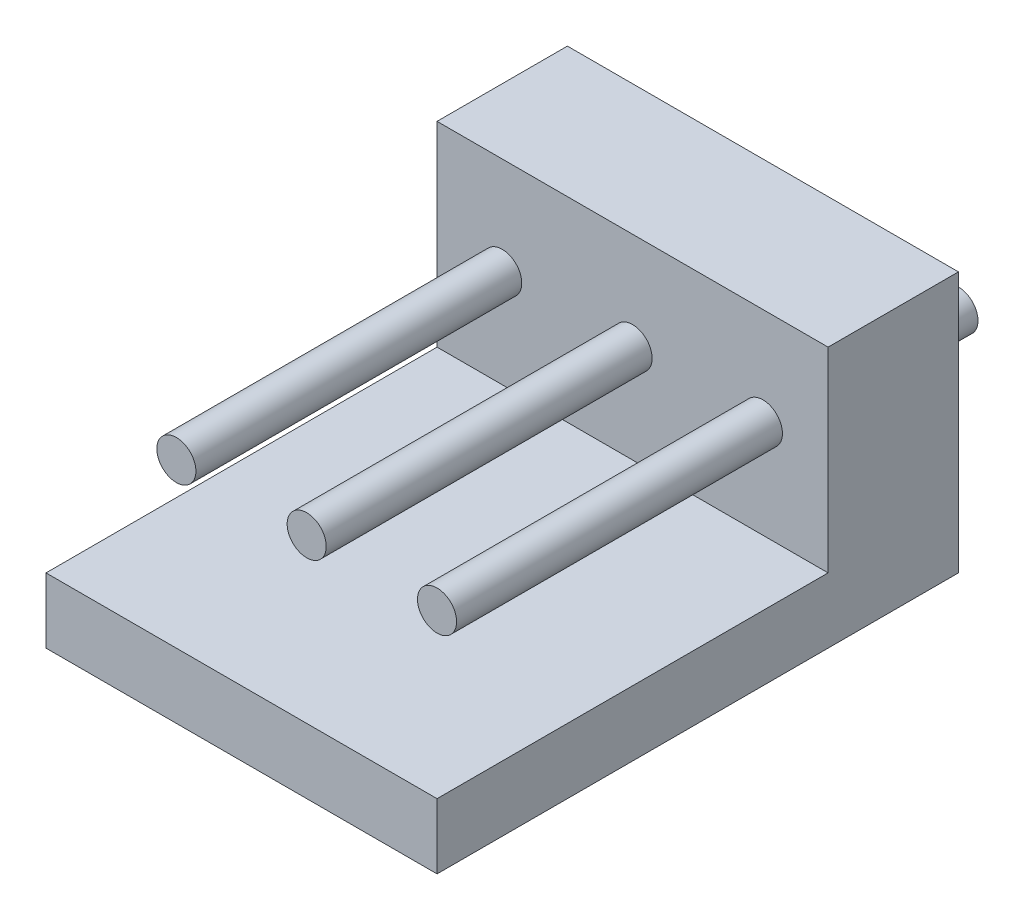
ISO-10303-21;
HEADER;
FILE_DESCRIPTION(('STEP AP214'),'2;1');
FILE_NAME('part.step','',(''),(''),'','','');
FILE_SCHEMA(('AUTOMOTIVE_DESIGN { 1 0 10303 214 1 1 1 1 }'));
ENDSEC;
DATA;
#1=APPLICATION_CONTEXT('core data for automotive mechanical design processes');
#2=APPLICATION_PROTOCOL_DEFINITION('international standard','automotive_design',2000,#1);
#3=PRODUCT_CONTEXT('',#1,'mechanical');
#4=PRODUCT('Part','Part','',(#3));
#5=PRODUCT_RELATED_PRODUCT_CATEGORY('part','',(#4));
#6=PRODUCT_DEFINITION_FORMATION('','',#4);
#7=PRODUCT_DEFINITION_CONTEXT('part definition',#1,'design');
#8=PRODUCT_DEFINITION('design','',#6,#7);
#9=PRODUCT_DEFINITION_SHAPE('','',#8);
#10=(LENGTH_UNIT() NAMED_UNIT(*) SI_UNIT(.MILLI.,.METRE.));
#11=(NAMED_UNIT(*) PLANE_ANGLE_UNIT() SI_UNIT($,.RADIAN.));
#12=(NAMED_UNIT(*) SI_UNIT($,.STERADIAN.) SOLID_ANGLE_UNIT());
#13=UNCERTAINTY_MEASURE_WITH_UNIT(LENGTH_MEASURE(1.E-05),#10,'distance_accuracy_value','');
#14=(GEOMETRIC_REPRESENTATION_CONTEXT(3) GLOBAL_UNCERTAINTY_ASSIGNED_CONTEXT((#13)) GLOBAL_UNIT_ASSIGNED_CONTEXT((#10,
#11,#12)) REPRESENTATION_CONTEXT('',''));
#15=CARTESIAN_POINT('',(0.,0.,0.));
#16=DIRECTION('',(0.,0.,1.));
#17=DIRECTION('',(1.,0.,0.));
#18=AXIS2_PLACEMENT_3D('',#15,#16,#17);
#19=CARTESIAN_POINT('',(0.,10.,5.));
#20=DIRECTION('',(0.,0.,-1.));
#21=DIRECTION('',(-1.,0.,0.));
#22=AXIS2_PLACEMENT_3D('',#19,#20,#21);
#23=PLANE('',#22);
#24=CARTESIAN_POINT('',(12.5,6.25,5.));
#25=DIRECTION('',(0.,0.,-1.));
#26=DIRECTION('',(-1.,0.,0.));
#27=AXIS2_PLACEMENT_3D('',#24,#25,#26);
#28=CIRCLE('',#27,0.750000000000002);
#29=CARTESIAN_POINT('',(11.75,6.25,5.));
#30=VERTEX_POINT('',#29);
#31=EDGE_CURVE('E37',#30,#30,#28,.F.);
#32=ORIENTED_EDGE('',*,*,#31,.F.);
#33=EDGE_LOOP('',(#32));
#34=FACE_BOUND('',#33,.T.);
#35=DIRECTION('',(-1.,0.,0.));
#36=VECTOR('',#35,1.);
#37=CARTESIAN_POINT('',(0.,2.5,5.));
#38=LINE('',#37,#36);
#39=CARTESIAN_POINT('',(15.,2.5,5.));
#40=VERTEX_POINT('',#39);
#41=CARTESIAN_POINT('',(0.,2.5,5.));
#42=VERTEX_POINT('',#41);
#43=EDGE_CURVE('E45',#40,#42,#38,.T.);
#44=ORIENTED_EDGE('',*,*,#43,.F.);
#45=DIRECTION('',(0.,1.,0.));
#46=VECTOR('',#45,1.);
#47=CARTESIAN_POINT('',(15.,0.,5.));
#48=LINE('',#47,#46);
#49=CARTESIAN_POINT('',(15.,10.,5.));
#50=VERTEX_POINT('',#49);
#51=EDGE_CURVE('E85',#40,#50,#48,.T.);
#52=ORIENTED_EDGE('',*,*,#51,.T.);
#53=DIRECTION('',(-1.,0.,0.));
#54=VECTOR('',#53,1.);
#55=CARTESIAN_POINT('',(0.,10.,5.));
#56=LINE('',#55,#54);
#57=CARTESIAN_POINT('',(0.,10.,5.));
#58=VERTEX_POINT('',#57);
#59=EDGE_CURVE('E50',#50,#58,#56,.T.);
#60=ORIENTED_EDGE('',*,*,#59,.T.);
#61=DIRECTION('',(0.,-1.,0.));
#62=VECTOR('',#61,1.);
#63=CARTESIAN_POINT('',(0.,0.,5.));
#64=LINE('',#63,#62);
#65=EDGE_CURVE('E80',#58,#42,#64,.T.);
#66=ORIENTED_EDGE('',*,*,#65,.T.);
#67=EDGE_LOOP('',(#44,#52,#60,#66));
#68=FACE_BOUND('',#67,.T.);
#69=CARTESIAN_POINT('',(7.50000000000001,6.25,5.));
#70=DIRECTION('',(0.,0.,-1.));
#71=DIRECTION('',(-1.,0.,0.));
#72=AXIS2_PLACEMENT_3D('',#69,#70,#71);
#73=CIRCLE('',#72,0.749999999999998);
#74=CARTESIAN_POINT('',(6.75000000000001,6.25,5.));
#75=VERTEX_POINT('',#74);
#76=EDGE_CURVE('E134',#75,#75,#73,.F.);
#77=ORIENTED_EDGE('',*,*,#76,.F.);
#78=EDGE_LOOP('',(#77));
#79=FACE_BOUND('',#78,.T.);
#80=CARTESIAN_POINT('',(2.5,6.25,5.));
#81=DIRECTION('',(0.,0.,-1.));
#82=DIRECTION('',(-1.,0.,0.));
#83=AXIS2_PLACEMENT_3D('',#80,#81,#82);
#84=CIRCLE('',#83,0.75);
#85=CARTESIAN_POINT('',(1.75,6.25,5.));
#86=VERTEX_POINT('',#85);
#87=EDGE_CURVE('E11',#86,#86,#84,.F.);
#88=ORIENTED_EDGE('',*,*,#87,.F.);
#89=EDGE_LOOP('',(#88));
#90=FACE_BOUND('',#89,.T.);
#91=ADVANCED_FACE('F28',(#34,#68,#79,#90),#23,.F.);
#92=CARTESIAN_POINT('',(0.,10.,0.));
#93=DIRECTION('',(0.,0.,-1.));
#94=DIRECTION('',(-1.,0.,0.));
#95=AXIS2_PLACEMENT_3D('',#92,#93,#94);
#96=PLANE('',#95);
#97=CARTESIAN_POINT('',(12.5,6.25,0.));
#98=DIRECTION('',(0.,0.,-1.));
#99=DIRECTION('',(-1.,0.,0.));
#100=AXIS2_PLACEMENT_3D('',#97,#98,#99);
#101=CIRCLE('',#100,0.750000000000002);
#102=CARTESIAN_POINT('',(11.75,6.25,0.));
#103=VERTEX_POINT('',#102);
#104=EDGE_CURVE('E117',#103,#103,#101,.F.);
#105=ORIENTED_EDGE('',*,*,#104,.T.);
#106=EDGE_LOOP('',(#105));
#107=FACE_BOUND('',#106,.T.);
#108=DIRECTION('',(0.,-1.,0.));
#109=VECTOR('',#108,1.);
#110=CARTESIAN_POINT('',(0.,0.,0.));
#111=LINE('',#110,#109);
#112=CARTESIAN_POINT('',(0.,10.,0.));
#113=VERTEX_POINT('',#112);
#114=CARTESIAN_POINT('',(0.,0.,0.));
#115=VERTEX_POINT('',#114);
#116=EDGE_CURVE('E104',#113,#115,#111,.T.);
#117=ORIENTED_EDGE('',*,*,#116,.F.);
#118=DIRECTION('',(-1.,0.,0.));
#119=VECTOR('',#118,1.);
#120=CARTESIAN_POINT('',(0.,10.,0.));
#121=LINE('',#120,#119);
#122=CARTESIAN_POINT('',(15.,10.,0.));
#123=VERTEX_POINT('',#122);
#124=EDGE_CURVE('E86',#123,#113,#121,.T.);
#125=ORIENTED_EDGE('',*,*,#124,.F.);
#126=DIRECTION('',(0.,1.,0.));
#127=VECTOR('',#126,1.);
#128=CARTESIAN_POINT('',(15.,0.,0.));
#129=LINE('',#128,#127);
#130=CARTESIAN_POINT('',(15.,0.,0.));
#131=VERTEX_POINT('',#130);
#132=EDGE_CURVE('E150',#131,#123,#129,.T.);
#133=ORIENTED_EDGE('',*,*,#132,.F.);
#134=DIRECTION('',(1.,0.,0.));
#135=VECTOR('',#134,1.);
#136=CARTESIAN_POINT('',(0.,0.,0.));
#137=LINE('',#136,#135);
#138=EDGE_CURVE('E148',#115,#131,#137,.T.);
#139=ORIENTED_EDGE('',*,*,#138,.F.);
#140=EDGE_LOOP('',(#117,#125,#133,#139));
#141=FACE_BOUND('',#140,.T.);
#142=CARTESIAN_POINT('',(7.50000000000001,6.25,0.));
#143=DIRECTION('',(0.,0.,-1.));
#144=DIRECTION('',(-1.,0.,0.));
#145=AXIS2_PLACEMENT_3D('',#142,#143,#144);
#146=CIRCLE('',#145,0.749999999999998);
#147=CARTESIAN_POINT('',(6.75000000000001,6.25,0.));
#148=VERTEX_POINT('',#147);
#149=EDGE_CURVE('E98',#148,#148,#146,.F.);
#150=ORIENTED_EDGE('',*,*,#149,.T.);
#151=EDGE_LOOP('',(#150));
#152=FACE_BOUND('',#151,.T.);
#153=CARTESIAN_POINT('',(2.5,6.25,0.));
#154=DIRECTION('',(0.,0.,-1.));
#155=DIRECTION('',(-1.,0.,0.));
#156=AXIS2_PLACEMENT_3D('',#153,#154,#155);
#157=CIRCLE('',#156,0.75);
#158=CARTESIAN_POINT('',(1.75,6.25,0.));
#159=VERTEX_POINT('',#158);
#160=EDGE_CURVE('E32',#159,#159,#157,.F.);
#161=ORIENTED_EDGE('',*,*,#160,.T.);
#162=EDGE_LOOP('',(#161));
#163=FACE_BOUND('',#162,.T.);
#164=ADVANCED_FACE('F177',(#107,#141,#152,#163),#96,.T.);
#165=CARTESIAN_POINT('',(0.,0.,5.));
#166=DIRECTION('',(1.,0.,0.));
#167=DIRECTION('',(0.,0.,-1.));
#168=AXIS2_PLACEMENT_3D('',#165,#166,#167);
#169=PLANE('',#168);
#170=ORIENTED_EDGE('',*,*,#116,.T.);
#171=DIRECTION('',(0.,0.,-1.));
#172=VECTOR('',#171,1.);
#173=CARTESIAN_POINT('',(0.,0.,5.));
#174=LINE('',#173,#172);
#175=CARTESIAN_POINT('',(0.,0.,20.));
#176=VERTEX_POINT('',#175);
#177=EDGE_CURVE('E139',#176,#115,#174,.T.);
#178=ORIENTED_EDGE('',*,*,#177,.F.);
#179=DIRECTION('',(0.,-1.,0.));
#180=VECTOR('',#179,1.);
#181=CARTESIAN_POINT('',(0.,0.,20.));
#182=LINE('',#181,#180);
#183=CARTESIAN_POINT('',(0.,2.5,20.));
#184=VERTEX_POINT('',#183);
#185=EDGE_CURVE('E97',#184,#176,#182,.T.);
#186=ORIENTED_EDGE('',*,*,#185,.F.);
#187=DIRECTION('',(0.,0.,-1.));
#188=VECTOR('',#187,1.);
#189=CARTESIAN_POINT('',(0.,2.5,20.));
#190=LINE('',#189,#188);
#191=EDGE_CURVE('E93',#184,#42,#190,.T.);
#192=ORIENTED_EDGE('',*,*,#191,.T.);
#193=ORIENTED_EDGE('',*,*,#65,.F.);
#194=DIRECTION('',(0.,0.,-1.));
#195=VECTOR('',#194,1.);
#196=CARTESIAN_POINT('',(0.,10.,5.));
#197=LINE('',#196,#195);
#198=EDGE_CURVE('E160',#58,#113,#197,.T.);
#199=ORIENTED_EDGE('',*,*,#198,.T.);
#200=EDGE_LOOP('',(#170,#178,#186,#192,#193,#199));
#201=FACE_BOUND('',#200,.T.);
#202=ADVANCED_FACE('F30',(#201),#169,.F.);
#203=CARTESIAN_POINT('',(0.,0.,5.));
#204=DIRECTION('',(0.,1.,0.));
#205=DIRECTION('',(0.,0.,1.));
#206=AXIS2_PLACEMENT_3D('',#203,#204,#205);
#207=PLANE('',#206);
#208=ORIENTED_EDGE('',*,*,#138,.T.);
#209=DIRECTION('',(0.,0.,-1.));
#210=VECTOR('',#209,1.);
#211=CARTESIAN_POINT('',(15.,0.,5.));
#212=LINE('',#211,#210);
#213=CARTESIAN_POINT('',(15.,0.,20.));
#214=VERTEX_POINT('',#213);
#215=EDGE_CURVE('E165',#214,#131,#212,.T.);
#216=ORIENTED_EDGE('',*,*,#215,.F.);
#217=DIRECTION('',(1.,0.,0.));
#218=VECTOR('',#217,1.);
#219=CARTESIAN_POINT('',(0.,0.,20.));
#220=LINE('',#219,#218);
#221=EDGE_CURVE('E143',#176,#214,#220,.T.);
#222=ORIENTED_EDGE('',*,*,#221,.F.);
#223=ORIENTED_EDGE('',*,*,#177,.T.);
#224=EDGE_LOOP('',(#208,#216,#222,#223));
#225=FACE_BOUND('',#224,.T.);
#226=ADVANCED_FACE('F173',(#225),#207,.F.);
#227=CARTESIAN_POINT('',(15.,0.,5.));
#228=DIRECTION('',(-1.,0.,0.));
#229=DIRECTION('',(0.,0.,1.));
#230=AXIS2_PLACEMENT_3D('',#227,#228,#229);
#231=PLANE('',#230);
#232=ORIENTED_EDGE('',*,*,#132,.T.);
#233=DIRECTION('',(0.,0.,-1.));
#234=VECTOR('',#233,1.);
#235=CARTESIAN_POINT('',(15.,10.,5.));
#236=LINE('',#235,#234);
#237=EDGE_CURVE('E161',#50,#123,#236,.T.);
#238=ORIENTED_EDGE('',*,*,#237,.F.);
#239=ORIENTED_EDGE('',*,*,#51,.F.);
#240=DIRECTION('',(0.,0.,-1.));
#241=VECTOR('',#240,1.);
#242=CARTESIAN_POINT('',(15.,2.5,20.));
#243=LINE('',#242,#241);
#244=CARTESIAN_POINT('',(15.,2.5,20.));
#245=VERTEX_POINT('',#244);
#246=EDGE_CURVE('E96',#245,#40,#243,.T.);
#247=ORIENTED_EDGE('',*,*,#246,.F.);
#248=DIRECTION('',(0.,1.,0.));
#249=VECTOR('',#248,1.);
#250=CARTESIAN_POINT('',(15.,0.,20.));
#251=LINE('',#250,#249);
#252=EDGE_CURVE('E106',#214,#245,#251,.T.);
#253=ORIENTED_EDGE('',*,*,#252,.F.);
#254=ORIENTED_EDGE('',*,*,#215,.T.);
#255=EDGE_LOOP('',(#232,#238,#239,#247,#253,#254));
#256=FACE_BOUND('',#255,.T.);
#257=ADVANCED_FACE('F179',(#256),#231,.F.);
#258=CARTESIAN_POINT('',(0.,10.,5.));
#259=DIRECTION('',(0.,-1.,0.));
#260=DIRECTION('',(0.,0.,-1.));
#261=AXIS2_PLACEMENT_3D('',#258,#259,#260);
#262=PLANE('',#261);
#263=ORIENTED_EDGE('',*,*,#124,.T.);
#264=ORIENTED_EDGE('',*,*,#198,.F.);
#265=ORIENTED_EDGE('',*,*,#59,.F.);
#266=ORIENTED_EDGE('',*,*,#237,.T.);
#267=EDGE_LOOP('',(#263,#264,#265,#266));
#268=FACE_BOUND('',#267,.T.);
#269=ADVANCED_FACE('F181',(#268),#262,.F.);
#270=CARTESIAN_POINT('',(0.,2.5,20.));
#271=DIRECTION('',(0.,-1.,0.));
#272=DIRECTION('',(0.,0.,-1.));
#273=AXIS2_PLACEMENT_3D('',#270,#271,#272);
#274=PLANE('',#273);
#275=ORIENTED_EDGE('',*,*,#43,.T.);
#276=ORIENTED_EDGE('',*,*,#191,.F.);
#277=DIRECTION('',(-1.,0.,0.));
#278=VECTOR('',#277,1.);
#279=CARTESIAN_POINT('',(0.,2.5,20.));
#280=LINE('',#279,#278);
#281=EDGE_CURVE('E102',#245,#184,#280,.T.);
#282=ORIENTED_EDGE('',*,*,#281,.F.);
#283=ORIENTED_EDGE('',*,*,#246,.T.);
#284=EDGE_LOOP('',(#275,#276,#282,#283));
#285=FACE_BOUND('',#284,.T.);
#286=ADVANCED_FACE('F91',(#285),#274,.F.);
#287=CARTESIAN_POINT('',(0.,2.5,20.));
#288=DIRECTION('',(0.,0.,-1.));
#289=DIRECTION('',(-1.,0.,0.));
#290=AXIS2_PLACEMENT_3D('',#287,#288,#289);
#291=PLANE('',#290);
#292=ORIENTED_EDGE('',*,*,#185,.T.);
#293=ORIENTED_EDGE('',*,*,#221,.T.);
#294=ORIENTED_EDGE('',*,*,#252,.T.);
#295=ORIENTED_EDGE('',*,*,#281,.T.);
#296=EDGE_LOOP('',(#292,#293,#294,#295));
#297=FACE_BOUND('',#296,.T.);
#298=ADVANCED_FACE('F188',(#297),#291,.F.);
#299=CARTESIAN_POINT('',(7.50000000000001,6.25,-2.5));
#300=DIRECTION('',(0.,0.,1.));
#301=DIRECTION('',(1.,0.,0.));
#302=AXIS2_PLACEMENT_3D('',#299,#300,#301);
#303=PLANE('',#302);
#304=CARTESIAN_POINT('',(7.50000000000001,6.25,-2.5));
#305=DIRECTION('',(0.,0.,1.));
#306=DIRECTION('',(1.,0.,0.));
#307=AXIS2_PLACEMENT_3D('',#304,#305,#306);
#308=CIRCLE('',#307,0.749999999999998);
#309=CARTESIAN_POINT('',(8.25000000000001,6.25,-2.5));
#310=VERTEX_POINT('',#309);
#311=EDGE_CURVE('E119',#310,#310,#308,.T.);
#312=ORIENTED_EDGE('',*,*,#311,.F.);
#313=EDGE_LOOP('',(#312));
#314=FACE_BOUND('',#313,.T.);
#315=ADVANCED_FACE('F202',(#314),#303,.F.);
#316=CARTESIAN_POINT('',(7.50000000000001,6.25,17.5));
#317=DIRECTION('',(0.,0.,-1.));
#318=DIRECTION('',(-1.,0.,0.));
#319=AXIS2_PLACEMENT_3D('',#316,#317,#318);
#320=CYLINDRICAL_SURFACE('',#319,0.749999999999998);
#321=ORIENTED_EDGE('',*,*,#149,.F.);
#322=EDGE_LOOP('',(#321));
#323=FACE_BOUND('',#322,.T.);
#324=ORIENTED_EDGE('',*,*,#311,.T.);
#325=EDGE_LOOP('',(#324));
#326=FACE_BOUND('',#325,.T.);
#327=ADVANCED_FACE('F204',(#323,#326),#320,.T.);
#328=CARTESIAN_POINT('',(7.50000000000001,6.25,17.5));
#329=DIRECTION('',(0.,0.,1.));
#330=DIRECTION('',(1.,0.,0.));
#331=AXIS2_PLACEMENT_3D('',#328,#329,#330);
#332=CIRCLE('',#331,0.749999999999998);
#333=CARTESIAN_POINT('',(8.25000000000001,6.25,17.5));
#334=VERTEX_POINT('',#333);
#335=EDGE_CURVE('E116',#334,#334,#332,.T.);
#336=ORIENTED_EDGE('',*,*,#335,.F.);
#337=EDGE_LOOP('',(#336));
#338=FACE_BOUND('',#337,.T.);
#339=ORIENTED_EDGE('',*,*,#76,.T.);
#340=EDGE_LOOP('',(#339));
#341=FACE_BOUND('',#340,.T.);
#342=ADVANCED_FACE('F207',(#338,#341),#320,.T.);
#343=CARTESIAN_POINT('',(7.50000000000001,6.25,17.5));
#344=DIRECTION('',(0.,0.,1.));
#345=DIRECTION('',(1.,0.,0.));
#346=AXIS2_PLACEMENT_3D('',#343,#344,#345);
#347=PLANE('',#346);
#348=ORIENTED_EDGE('',*,*,#335,.T.);
#349=EDGE_LOOP('',(#348));
#350=FACE_BOUND('',#349,.T.);
#351=ADVANCED_FACE('F209',(#350),#347,.T.);
#352=CARTESIAN_POINT('',(12.5,6.25,-2.5));
#353=DIRECTION('',(0.,0.,1.));
#354=DIRECTION('',(1.,0.,0.));
#355=AXIS2_PLACEMENT_3D('',#352,#353,#354);
#356=PLANE('',#355);
#357=CARTESIAN_POINT('',(12.5,6.25,-2.5));
#358=DIRECTION('',(0.,0.,1.));
#359=DIRECTION('',(1.,0.,0.));
#360=AXIS2_PLACEMENT_3D('',#357,#358,#359);
#361=CIRCLE('',#360,0.750000000000002);
#362=CARTESIAN_POINT('',(13.25,6.25,-2.5));
#363=VERTEX_POINT('',#362);
#364=EDGE_CURVE('E126',#363,#363,#361,.T.);
#365=ORIENTED_EDGE('',*,*,#364,.F.);
#366=EDGE_LOOP('',(#365));
#367=FACE_BOUND('',#366,.T.);
#368=ADVANCED_FACE('F212',(#367),#356,.F.);
#369=CARTESIAN_POINT('',(12.5,6.25,17.5));
#370=DIRECTION('',(0.,0.,-1.));
#371=DIRECTION('',(-1.,0.,0.));
#372=AXIS2_PLACEMENT_3D('',#369,#370,#371);
#373=CYLINDRICAL_SURFACE('',#372,0.750000000000002);
#374=ORIENTED_EDGE('',*,*,#104,.F.);
#375=EDGE_LOOP('',(#374));
#376=FACE_BOUND('',#375,.T.);
#377=ORIENTED_EDGE('',*,*,#364,.T.);
#378=EDGE_LOOP('',(#377));
#379=FACE_BOUND('',#378,.T.);
#380=ADVANCED_FACE('F217',(#376,#379),#373,.T.);
#381=CARTESIAN_POINT('',(12.5,6.25,17.5));
#382=DIRECTION('',(0.,0.,1.));
#383=DIRECTION('',(1.,0.,0.));
#384=AXIS2_PLACEMENT_3D('',#381,#382,#383);
#385=CIRCLE('',#384,0.750000000000002);
#386=CARTESIAN_POINT('',(13.25,6.25,17.5));
#387=VERTEX_POINT('',#386);
#388=EDGE_CURVE('E120',#387,#387,#385,.T.);
#389=ORIENTED_EDGE('',*,*,#388,.F.);
#390=EDGE_LOOP('',(#389));
#391=FACE_BOUND('',#390,.T.);
#392=ORIENTED_EDGE('',*,*,#31,.T.);
#393=EDGE_LOOP('',(#392));
#394=FACE_BOUND('',#393,.T.);
#395=ADVANCED_FACE('F220',(#391,#394),#373,.T.);
#396=CARTESIAN_POINT('',(12.5,6.25,17.5));
#397=DIRECTION('',(0.,0.,1.));
#398=DIRECTION('',(1.,0.,0.));
#399=AXIS2_PLACEMENT_3D('',#396,#397,#398);
#400=PLANE('',#399);
#401=ORIENTED_EDGE('',*,*,#388,.T.);
#402=EDGE_LOOP('',(#401));
#403=FACE_BOUND('',#402,.T.);
#404=ADVANCED_FACE('F222',(#403),#400,.T.);
#405=CARTESIAN_POINT('',(2.5,6.25,-2.5));
#406=DIRECTION('',(0.,0.,1.));
#407=DIRECTION('',(1.,0.,0.));
#408=AXIS2_PLACEMENT_3D('',#405,#406,#407);
#409=PLANE('',#408);
#410=CARTESIAN_POINT('',(2.5,6.25,-2.5));
#411=DIRECTION('',(0.,0.,1.));
#412=DIRECTION('',(1.,0.,0.));
#413=AXIS2_PLACEMENT_3D('',#410,#411,#412);
#414=CIRCLE('',#413,0.75);
#415=CARTESIAN_POINT('',(3.25,6.25,-2.5));
#416=VERTEX_POINT('',#415);
#417=EDGE_CURVE('E244',#416,#416,#414,.T.);
#418=ORIENTED_EDGE('',*,*,#417,.F.);
#419=EDGE_LOOP('',(#418));
#420=FACE_BOUND('',#419,.T.);
#421=ADVANCED_FACE('F225',(#420),#409,.F.);
#422=CARTESIAN_POINT('',(2.5,6.25,17.5));
#423=DIRECTION('',(0.,0.,-1.));
#424=DIRECTION('',(-1.,0.,0.));
#425=AXIS2_PLACEMENT_3D('',#422,#423,#424);
#426=CYLINDRICAL_SURFACE('',#425,0.75);
#427=ORIENTED_EDGE('',*,*,#160,.F.);
#428=EDGE_LOOP('',(#427));
#429=FACE_BOUND('',#428,.T.);
#430=ORIENTED_EDGE('',*,*,#417,.T.);
#431=EDGE_LOOP('',(#430));
#432=FACE_BOUND('',#431,.T.);
#433=ADVANCED_FACE('F229',(#429,#432),#426,.T.);
#434=CARTESIAN_POINT('',(2.5,6.25,17.5));
#435=DIRECTION('',(0.,0.,1.));
#436=DIRECTION('',(1.,0.,0.));
#437=AXIS2_PLACEMENT_3D('',#434,#435,#436);
#438=CIRCLE('',#437,0.75);
#439=CARTESIAN_POINT('',(3.25,6.25,17.5));
#440=VERTEX_POINT('',#439);
#441=EDGE_CURVE('E246',#440,#440,#438,.T.);
#442=ORIENTED_EDGE('',*,*,#441,.F.);
#443=EDGE_LOOP('',(#442));
#444=FACE_BOUND('',#443,.T.);
#445=ORIENTED_EDGE('',*,*,#87,.T.);
#446=EDGE_LOOP('',(#445));
#447=FACE_BOUND('',#446,.T.);
#448=ADVANCED_FACE('F232',(#444,#447),#426,.T.);
#449=CARTESIAN_POINT('',(2.5,6.25,17.5));
#450=DIRECTION('',(0.,0.,1.));
#451=DIRECTION('',(1.,0.,0.));
#452=AXIS2_PLACEMENT_3D('',#449,#450,#451);
#453=PLANE('',#452);
#454=ORIENTED_EDGE('',*,*,#441,.T.);
#455=EDGE_LOOP('',(#454));
#456=FACE_BOUND('',#455,.T.);
#457=ADVANCED_FACE('F234',(#456),#453,.T.);
#458=CLOSED_SHELL('',(#91,#164,#202,#226,#257,#269,#286,#298,#315,#327,#342,#351,#368,#380,#395,
#404,#421,#433,#448,#457));
#459=MANIFOLD_SOLID_BREP('B2',#458);
#460=ADVANCED_BREP_SHAPE_REPRESENTATION('',(#18,#459),#14);
#461=SHAPE_DEFINITION_REPRESENTATION(#9,#460);
ENDSEC;
END-ISO-10303-21;
